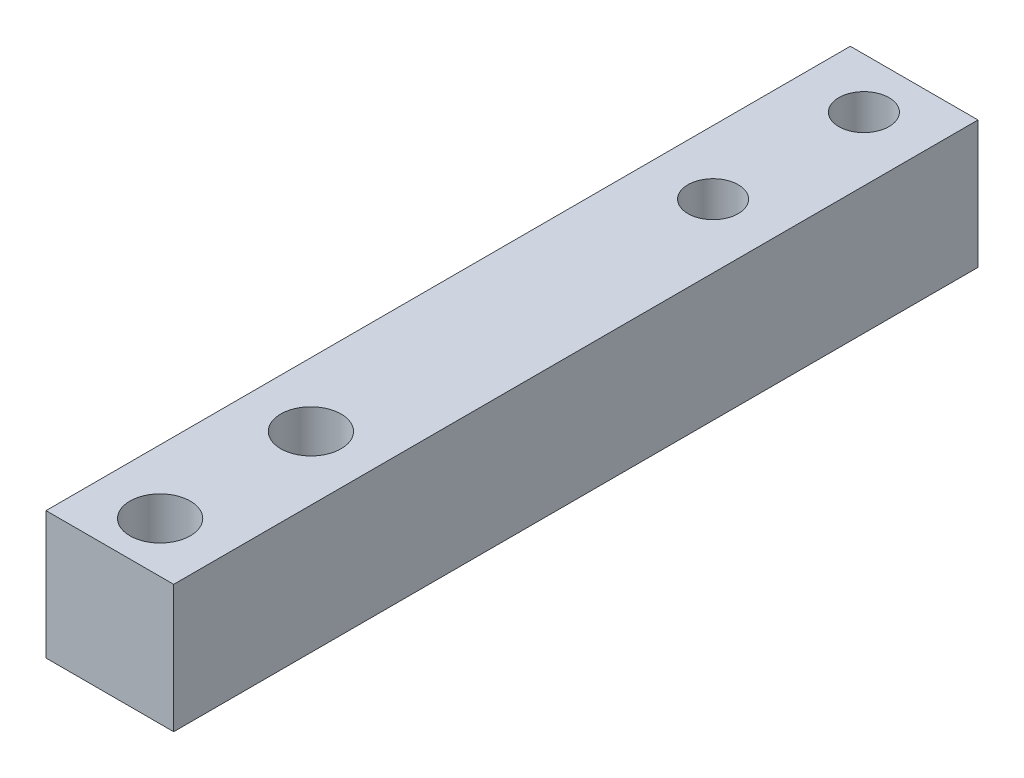
ISO-10303-21;
HEADER;
FILE_DESCRIPTION(('STEP AP214'),'2;1');
FILE_NAME('part.step','',(''),(''),'','','');
FILE_SCHEMA(('AUTOMOTIVE_DESIGN { 1 0 10303 214 1 1 1 1 }'));
ENDSEC;
DATA;
#1=APPLICATION_CONTEXT('core data for automotive mechanical design processes');
#2=APPLICATION_PROTOCOL_DEFINITION('international standard','automotive_design',2000,#1);
#3=PRODUCT_CONTEXT('',#1,'mechanical');
#4=PRODUCT('Part','Part','',(#3));
#5=PRODUCT_RELATED_PRODUCT_CATEGORY('part','',(#4));
#6=PRODUCT_DEFINITION_FORMATION('','',#4);
#7=PRODUCT_DEFINITION_CONTEXT('part definition',#1,'design');
#8=PRODUCT_DEFINITION('design','',#6,#7);
#9=PRODUCT_DEFINITION_SHAPE('','',#8);
#10=(LENGTH_UNIT() NAMED_UNIT(*) SI_UNIT(.MILLI.,.METRE.));
#11=(NAMED_UNIT(*) PLANE_ANGLE_UNIT() SI_UNIT($,.RADIAN.));
#12=(NAMED_UNIT(*) SI_UNIT($,.STERADIAN.) SOLID_ANGLE_UNIT());
#13=UNCERTAINTY_MEASURE_WITH_UNIT(LENGTH_MEASURE(1.E-05),#10,'distance_accuracy_value','');
#14=(GEOMETRIC_REPRESENTATION_CONTEXT(3) GLOBAL_UNCERTAINTY_ASSIGNED_CONTEXT((#13)) GLOBAL_UNIT_ASSIGNED_CONTEXT((#10,
#11,#12)) REPRESENTATION_CONTEXT('',''));
#15=CARTESIAN_POINT('',(0.,0.,0.));
#16=DIRECTION('',(0.,0.,1.));
#17=DIRECTION('',(1.,0.,0.));
#18=AXIS2_PLACEMENT_3D('',#15,#16,#17);
#19=CARTESIAN_POINT('',(-6.35000000000001,12.7,-40.));
#20=DIRECTION('',(1.,0.,0.));
#21=DIRECTION('',(0.,0.,-1.));
#22=AXIS2_PLACEMENT_3D('',#19,#20,#21);
#23=PLANE('',#22);
#24=DIRECTION('',(0.,0.,1.));
#25=VECTOR('',#24,1.);
#26=CARTESIAN_POINT('',(-6.35000000000001,0.,-40.));
#27=LINE('',#26,#25);
#28=CARTESIAN_POINT('',(-6.35000000000001,0.,-40.));
#29=VERTEX_POINT('',#28);
#30=CARTESIAN_POINT('',(-6.34999999999999,0.,40.));
#31=VERTEX_POINT('',#30);
#32=EDGE_CURVE('E102',#29,#31,#27,.T.);
#33=ORIENTED_EDGE('',*,*,#32,.T.);
#34=DIRECTION('',(0.,-1.,0.));
#35=VECTOR('',#34,1.);
#36=CARTESIAN_POINT('',(-6.34999999999999,12.7,40.));
#37=LINE('',#36,#35);
#38=CARTESIAN_POINT('',(-6.34999999999999,12.7,40.));
#39=VERTEX_POINT('',#38);
#40=EDGE_CURVE('E11',#39,#31,#37,.T.);
#41=ORIENTED_EDGE('',*,*,#40,.F.);
#42=DIRECTION('',(0.,0.,1.));
#43=VECTOR('',#42,1.);
#44=CARTESIAN_POINT('',(-6.35000000000001,12.7,-40.));
#45=LINE('',#44,#43);
#46=CARTESIAN_POINT('',(-6.35000000000001,12.7,-40.));
#47=VERTEX_POINT('',#46);
#48=EDGE_CURVE('E90',#47,#39,#45,.T.);
#49=ORIENTED_EDGE('',*,*,#48,.F.);
#50=DIRECTION('',(0.,-1.,0.));
#51=VECTOR('',#50,1.);
#52=CARTESIAN_POINT('',(-6.35000000000001,12.7,-40.));
#53=LINE('',#52,#51);
#54=EDGE_CURVE('E98',#47,#29,#53,.T.);
#55=ORIENTED_EDGE('',*,*,#54,.T.);
#56=EDGE_LOOP('',(#33,#41,#49,#55));
#57=FACE_BOUND('',#56,.T.);
#58=ADVANCED_FACE('F39',(#57),#23,.F.);
#59=CARTESIAN_POINT('',(-6.34999999999999,12.7,40.));
#60=DIRECTION('',(0.,0.,-1.));
#61=DIRECTION('',(-1.,0.,0.));
#62=AXIS2_PLACEMENT_3D('',#59,#60,#61);
#63=PLANE('',#62);
#64=DIRECTION('',(1.,0.,0.));
#65=VECTOR('',#64,1.);
#66=CARTESIAN_POINT('',(-6.34999999999999,0.,40.));
#67=LINE('',#66,#65);
#68=CARTESIAN_POINT('',(6.34999999999995,0.,40.));
#69=VERTEX_POINT('',#68);
#70=EDGE_CURVE('E94',#31,#69,#67,.T.);
#71=ORIENTED_EDGE('',*,*,#70,.T.);
#72=DIRECTION('',(0.,-1.,0.));
#73=VECTOR('',#72,1.);
#74=CARTESIAN_POINT('',(6.34999999999995,12.7,40.));
#75=LINE('',#74,#73);
#76=CARTESIAN_POINT('',(6.34999999999995,12.7,40.));
#77=VERTEX_POINT('',#76);
#78=EDGE_CURVE('E47',#77,#69,#75,.T.);
#79=ORIENTED_EDGE('',*,*,#78,.F.);
#80=DIRECTION('',(1.,0.,0.));
#81=VECTOR('',#80,1.);
#82=CARTESIAN_POINT('',(-6.34999999999999,12.7,40.));
#83=LINE('',#82,#81);
#84=EDGE_CURVE('E85',#39,#77,#83,.T.);
#85=ORIENTED_EDGE('',*,*,#84,.F.);
#86=ORIENTED_EDGE('',*,*,#40,.T.);
#87=EDGE_LOOP('',(#71,#79,#85,#86));
#88=FACE_BOUND('',#87,.T.);
#89=ADVANCED_FACE('F93',(#88),#63,.F.);
#90=CARTESIAN_POINT('',(6.34999999999995,12.7,-40.));
#91=DIRECTION('',(-1.,0.,0.));
#92=DIRECTION('',(0.,0.,1.));
#93=AXIS2_PLACEMENT_3D('',#90,#91,#92);
#94=PLANE('',#93);
#95=DIRECTION('',(0.,0.,-1.));
#96=VECTOR('',#95,1.);
#97=CARTESIAN_POINT('',(6.34999999999995,0.,-40.));
#98=LINE('',#97,#96);
#99=CARTESIAN_POINT('',(6.34999999999995,0.,-40.));
#100=VERTEX_POINT('',#99);
#101=EDGE_CURVE('E72',#69,#100,#98,.T.);
#102=ORIENTED_EDGE('',*,*,#101,.T.);
#103=DIRECTION('',(0.,-1.,0.));
#104=VECTOR('',#103,1.);
#105=CARTESIAN_POINT('',(6.34999999999995,12.7,-40.));
#106=LINE('',#105,#104);
#107=CARTESIAN_POINT('',(6.34999999999995,12.7,-40.));
#108=VERTEX_POINT('',#107);
#109=EDGE_CURVE('E95',#108,#100,#106,.T.);
#110=ORIENTED_EDGE('',*,*,#109,.F.);
#111=DIRECTION('',(0.,0.,-1.));
#112=VECTOR('',#111,1.);
#113=CARTESIAN_POINT('',(6.34999999999995,12.7,-40.));
#114=LINE('',#113,#112);
#115=EDGE_CURVE('E88',#77,#108,#114,.T.);
#116=ORIENTED_EDGE('',*,*,#115,.F.);
#117=ORIENTED_EDGE('',*,*,#78,.T.);
#118=EDGE_LOOP('',(#102,#110,#116,#117));
#119=FACE_BOUND('',#118,.T.);
#120=ADVANCED_FACE('F96',(#119),#94,.F.);
#121=CARTESIAN_POINT('',(-6.35000000000001,12.7,-40.));
#122=DIRECTION('',(0.,0.,1.));
#123=DIRECTION('',(1.,0.,0.));
#124=AXIS2_PLACEMENT_3D('',#121,#122,#123);
#125=PLANE('',#124);
#126=DIRECTION('',(-1.,0.,0.));
#127=VECTOR('',#126,1.);
#128=CARTESIAN_POINT('',(-6.35000000000001,0.,-40.));
#129=LINE('',#128,#127);
#130=EDGE_CURVE('E78',#100,#29,#129,.T.);
#131=ORIENTED_EDGE('',*,*,#130,.T.);
#132=ORIENTED_EDGE('',*,*,#54,.F.);
#133=DIRECTION('',(-1.,0.,0.));
#134=VECTOR('',#133,1.);
#135=CARTESIAN_POINT('',(-6.35000000000001,12.7,-40.));
#136=LINE('',#135,#134);
#137=EDGE_CURVE('E55',#108,#47,#136,.T.);
#138=ORIENTED_EDGE('',*,*,#137,.F.);
#139=ORIENTED_EDGE('',*,*,#109,.T.);
#140=EDGE_LOOP('',(#131,#132,#138,#139));
#141=FACE_BOUND('',#140,.T.);
#142=ADVANCED_FACE('F110',(#141),#125,.F.);
#143=CARTESIAN_POINT('',(0.,12.7,0.));
#144=DIRECTION('',(0.,1.,0.));
#145=DIRECTION('',(0.,0.,1.));
#146=AXIS2_PLACEMENT_3D('',#143,#144,#145);
#147=PLANE('',#146);
#148=CARTESIAN_POINT('',(0.,12.7,-35.));
#149=DIRECTION('',(0.,1.,0.));
#150=DIRECTION('',(0.,0.,1.));
#151=AXIS2_PLACEMENT_3D('',#148,#149,#150);
#152=CIRCLE('',#151,2.5);
#153=CARTESIAN_POINT('',(0.,12.7,-32.5));
#154=VERTEX_POINT('',#153);
#155=EDGE_CURVE('E132',#154,#154,#152,.T.);
#156=ORIENTED_EDGE('',*,*,#155,.F.);
#157=EDGE_LOOP('',(#156));
#158=FACE_BOUND('',#157,.T.);
#159=CARTESIAN_POINT('',(0.,12.7,-20.));
#160=DIRECTION('',(0.,1.,0.));
#161=DIRECTION('',(0.,0.,1.));
#162=AXIS2_PLACEMENT_3D('',#159,#160,#161);
#163=CIRCLE('',#162,2.5);
#164=CARTESIAN_POINT('',(0.,12.7,-17.5));
#165=VERTEX_POINT('',#164);
#166=EDGE_CURVE('E129',#165,#165,#163,.T.);
#167=ORIENTED_EDGE('',*,*,#166,.F.);
#168=EDGE_LOOP('',(#167));
#169=FACE_BOUND('',#168,.T.);
#170=CARTESIAN_POINT('',(0.,12.7,20.));
#171=DIRECTION('',(0.,1.,0.));
#172=DIRECTION('',(0.,0.,1.));
#173=AXIS2_PLACEMENT_3D('',#170,#171,#172);
#174=CIRCLE('',#173,3.);
#175=CARTESIAN_POINT('',(0.,12.7,23.));
#176=VERTEX_POINT('',#175);
#177=EDGE_CURVE('E123',#176,#176,#174,.T.);
#178=ORIENTED_EDGE('',*,*,#177,.F.);
#179=EDGE_LOOP('',(#178));
#180=FACE_BOUND('',#179,.T.);
#181=CARTESIAN_POINT('',(0.,12.7,35.));
#182=DIRECTION('',(0.,1.,0.));
#183=DIRECTION('',(0.,0.,1.));
#184=AXIS2_PLACEMENT_3D('',#181,#182,#183);
#185=CIRCLE('',#184,3.);
#186=CARTESIAN_POINT('',(0.,12.7,38.));
#187=VERTEX_POINT('',#186);
#188=EDGE_CURVE('E116',#187,#187,#185,.T.);
#189=ORIENTED_EDGE('',*,*,#188,.F.);
#190=EDGE_LOOP('',(#189));
#191=FACE_BOUND('',#190,.T.);
#192=ORIENTED_EDGE('',*,*,#48,.T.);
#193=ORIENTED_EDGE('',*,*,#84,.T.);
#194=ORIENTED_EDGE('',*,*,#115,.T.);
#195=ORIENTED_EDGE('',*,*,#137,.T.);
#196=EDGE_LOOP('',(#192,#193,#194,#195));
#197=FACE_BOUND('',#196,.T.);
#198=ADVANCED_FACE('F86',(#158,#169,#180,#191,#197),#147,.T.);
#199=CARTESIAN_POINT('',(0.,0.,0.));
#200=DIRECTION('',(0.,1.,0.));
#201=DIRECTION('',(0.,0.,1.));
#202=AXIS2_PLACEMENT_3D('',#199,#200,#201);
#203=PLANE('',#202);
#204=CARTESIAN_POINT('',(0.,0.,-35.));
#205=DIRECTION('',(0.,1.,0.));
#206=DIRECTION('',(0.,0.,1.));
#207=AXIS2_PLACEMENT_3D('',#204,#205,#206);
#208=CIRCLE('',#207,2.5);
#209=CARTESIAN_POINT('',(0.,0.,-32.5));
#210=VERTEX_POINT('',#209);
#211=EDGE_CURVE('E105',#210,#210,#208,.F.);
#212=ORIENTED_EDGE('',*,*,#211,.F.);
#213=EDGE_LOOP('',(#212));
#214=FACE_BOUND('',#213,.T.);
#215=CARTESIAN_POINT('',(0.,0.,-20.));
#216=DIRECTION('',(0.,1.,0.));
#217=DIRECTION('',(0.,0.,1.));
#218=AXIS2_PLACEMENT_3D('',#215,#216,#217);
#219=CIRCLE('',#218,2.5);
#220=CARTESIAN_POINT('',(0.,0.,-17.5));
#221=VERTEX_POINT('',#220);
#222=EDGE_CURVE('E126',#221,#221,#219,.F.);
#223=ORIENTED_EDGE('',*,*,#222,.F.);
#224=EDGE_LOOP('',(#223));
#225=FACE_BOUND('',#224,.T.);
#226=CARTESIAN_POINT('',(0.,0.,20.));
#227=DIRECTION('',(0.,1.,0.));
#228=DIRECTION('',(0.,0.,1.));
#229=AXIS2_PLACEMENT_3D('',#226,#227,#228);
#230=CIRCLE('',#229,3.);
#231=CARTESIAN_POINT('',(0.,0.,23.));
#232=VERTEX_POINT('',#231);
#233=EDGE_CURVE('E119',#232,#232,#230,.F.);
#234=ORIENTED_EDGE('',*,*,#233,.F.);
#235=EDGE_LOOP('',(#234));
#236=FACE_BOUND('',#235,.T.);
#237=CARTESIAN_POINT('',(0.,0.,35.));
#238=DIRECTION('',(0.,1.,0.));
#239=DIRECTION('',(0.,0.,1.));
#240=AXIS2_PLACEMENT_3D('',#237,#238,#239);
#241=CIRCLE('',#240,3.);
#242=CARTESIAN_POINT('',(0.,0.,38.));
#243=VERTEX_POINT('',#242);
#244=EDGE_CURVE('E120',#243,#243,#241,.F.);
#245=ORIENTED_EDGE('',*,*,#244,.F.);
#246=EDGE_LOOP('',(#245));
#247=FACE_BOUND('',#246,.T.);
#248=ORIENTED_EDGE('',*,*,#32,.F.);
#249=ORIENTED_EDGE('',*,*,#130,.F.);
#250=ORIENTED_EDGE('',*,*,#101,.F.);
#251=ORIENTED_EDGE('',*,*,#70,.F.);
#252=EDGE_LOOP('',(#248,#249,#250,#251));
#253=FACE_BOUND('',#252,.T.);
#254=ADVANCED_FACE('F113',(#214,#225,#236,#247,#253),#203,.F.);
#255=CARTESIAN_POINT('',(0.,-8.48528137423857,35.));
#256=DIRECTION('',(0.,1.,0.));
#257=DIRECTION('',(0.,0.,1.));
#258=AXIS2_PLACEMENT_3D('',#255,#256,#257);
#259=CYLINDRICAL_SURFACE('',#258,3.);
#260=CARTESIAN_POINT('',(0.,0.,38.));
#261=CARTESIAN_POINT('',(0.,0.132291666666665,38.));
#262=CARTESIAN_POINT('',(0.,0.264583333333331,38.));
#263=CARTESIAN_POINT('',(0.,0.529166666666664,38.));
#264=CARTESIAN_POINT('',(0.,0.661458333333331,38.));
#265=CARTESIAN_POINT('',(0.,0.926041666666665,38.));
#266=CARTESIAN_POINT('',(0.,1.05833333333333,38.));
#267=CARTESIAN_POINT('',(0.,1.32291666666667,38.));
#268=CARTESIAN_POINT('',(0.,1.45520833333333,38.));
#269=CARTESIAN_POINT('',(0.,1.71979166666667,38.));
#270=CARTESIAN_POINT('',(0.,1.85208333333333,38.));
#271=CARTESIAN_POINT('',(0.,2.11666666666667,38.));
#272=CARTESIAN_POINT('',(0.,2.24895833333333,38.));
#273=CARTESIAN_POINT('',(0.,2.51354166666667,38.));
#274=CARTESIAN_POINT('',(0.,2.64583333333333,38.));
#275=CARTESIAN_POINT('',(0.,2.91041666666667,38.));
#276=CARTESIAN_POINT('',(0.,3.04270833333333,38.));
#277=CARTESIAN_POINT('',(0.,3.30729166666667,38.));
#278=CARTESIAN_POINT('',(0.,3.43958333333333,38.));
#279=CARTESIAN_POINT('',(0.,3.70416666666667,38.));
#280=CARTESIAN_POINT('',(0.,3.83645833333333,38.));
#281=CARTESIAN_POINT('',(0.,4.10104166666667,38.));
#282=CARTESIAN_POINT('',(0.,4.23333333333333,38.));
#283=CARTESIAN_POINT('',(0.,4.49791666666667,38.));
#284=CARTESIAN_POINT('',(0.,4.63020833333333,38.));
#285=CARTESIAN_POINT('',(0.,4.89479166666667,38.));
#286=CARTESIAN_POINT('',(0.,5.02708333333333,38.));
#287=CARTESIAN_POINT('',(0.,5.29166666666667,38.));
#288=CARTESIAN_POINT('',(0.,5.42395833333333,38.));
#289=CARTESIAN_POINT('',(0.,5.68854166666667,38.));
#290=CARTESIAN_POINT('',(0.,5.82083333333333,38.));
#291=CARTESIAN_POINT('',(0.,6.08541666666667,38.));
#292=CARTESIAN_POINT('',(0.,6.21770833333333,38.));
#293=CARTESIAN_POINT('',(0.,6.48229166666667,38.));
#294=CARTESIAN_POINT('',(0.,6.61458333333333,38.));
#295=CARTESIAN_POINT('',(0.,6.87916666666667,38.));
#296=CARTESIAN_POINT('',(0.,7.01145833333333,38.));
#297=CARTESIAN_POINT('',(0.,7.27604166666666,38.));
#298=CARTESIAN_POINT('',(0.,7.40833333333333,38.));
#299=CARTESIAN_POINT('',(0.,7.67291666666666,38.));
#300=CARTESIAN_POINT('',(0.,7.80520833333333,38.));
#301=CARTESIAN_POINT('',(0.,8.06979166666666,38.));
#302=CARTESIAN_POINT('',(0.,8.20208333333333,38.));
#303=CARTESIAN_POINT('',(0.,8.46666666666667,38.));
#304=CARTESIAN_POINT('',(0.,8.59895833333333,38.));
#305=CARTESIAN_POINT('',(0.,8.86354166666666,38.));
#306=CARTESIAN_POINT('',(0.,8.99583333333333,38.));
#307=CARTESIAN_POINT('',(0.,9.26041666666666,38.));
#308=CARTESIAN_POINT('',(0.,9.39270833333333,38.));
#309=CARTESIAN_POINT('',(0.,9.65729166666667,38.));
#310=CARTESIAN_POINT('',(0.,9.78958333333333,38.));
#311=CARTESIAN_POINT('',(0.,10.0541666666667,38.));
#312=CARTESIAN_POINT('',(0.,10.1864583333333,38.));
#313=CARTESIAN_POINT('',(0.,10.4510416666667,38.));
#314=CARTESIAN_POINT('',(0.,10.5833333333333,38.));
#315=CARTESIAN_POINT('',(0.,10.8479166666667,38.));
#316=CARTESIAN_POINT('',(0.,10.9802083333333,38.));
#317=CARTESIAN_POINT('',(0.,11.2447916666667,38.));
#318=CARTESIAN_POINT('',(0.,11.3770833333333,38.));
#319=CARTESIAN_POINT('',(0.,11.6416666666667,38.));
#320=CARTESIAN_POINT('',(0.,11.7739583333333,38.));
#321=CARTESIAN_POINT('',(0.,12.0385416666667,38.));
#322=CARTESIAN_POINT('',(0.,12.1708333333333,38.));
#323=CARTESIAN_POINT('',(0.,12.4354166666667,38.));
#324=CARTESIAN_POINT('',(0.,12.5677083333333,38.));
#325=CARTESIAN_POINT('',(0.,12.7,38.));
#326=B_SPLINE_CURVE_WITH_KNOTS('',3,(#260,#261,#262,#263,#264,#265,#266,#267,#268,#269,#270,
#271,#272,#273,#274,#275,#276,#277,#278,#279,#280,#281,#282,#283,#284,#285,#286,#287,#288,#289,
#290,#291,#292,#293,#294,#295,#296,#297,#298,#299,#300,#301,#302,#303,#304,#305,#306,#307,#308,
#309,#310,#311,#312,#313,#314,#315,#316,#317,#318,#319,#320,#321,#322,#323,#324,#325),
.UNSPECIFIED.,.F.,.F.,(4,2,2,2,2,2,2,2,2,2,2,2,2,2,2,2,2,2,2,2,2,2,2,2,2,2,2,2,2,2,2,2,4),(0.,
0.396875,0.793749999999999,1.190625,1.5875,1.984375,2.38125,2.778125,3.175,3.571875,3.96875,
4.365625,4.7625,5.159375,5.55625,5.953125,6.35,6.746875,7.14375,7.540625,7.9375,8.334375,
8.73125,9.128125,9.525,9.921875,10.31875,10.715625,11.1125,11.509375,11.90625,12.303125,12.7),.UNSPECIFIED.);
#327=EDGE_CURVE('BSEAM151',#243,#187,#326,.T.);
#328=ORIENTED_EDGE('',*,*,#244,.T.);
#329=ORIENTED_EDGE('',*,*,#188,.T.);
#330=ORIENTED_EDGE('',*,*,#327,.T.);
#331=ORIENTED_EDGE('',*,*,#327,.F.);
#332=EDGE_LOOP('',(#328,#330,#329,#331));
#333=FACE_BOUND('',#332,.T.);
#334=ADVANCED_FACE('F151',(#333),#259,.F.);
#335=CARTESIAN_POINT('',(0.,-8.48528137423857,20.));
#336=DIRECTION('',(0.,1.,0.));
#337=DIRECTION('',(0.,0.,1.));
#338=AXIS2_PLACEMENT_3D('',#335,#336,#337);
#339=CYLINDRICAL_SURFACE('',#338,3.);
#340=CARTESIAN_POINT('',(0.,0.,23.));
#341=CARTESIAN_POINT('',(0.,0.132291666666665,23.));
#342=CARTESIAN_POINT('',(0.,0.264583333333331,23.));
#343=CARTESIAN_POINT('',(0.,0.529166666666664,23.));
#344=CARTESIAN_POINT('',(0.,0.661458333333331,23.));
#345=CARTESIAN_POINT('',(0.,0.926041666666665,23.));
#346=CARTESIAN_POINT('',(0.,1.05833333333333,23.));
#347=CARTESIAN_POINT('',(0.,1.32291666666667,23.));
#348=CARTESIAN_POINT('',(0.,1.45520833333333,23.));
#349=CARTESIAN_POINT('',(0.,1.71979166666667,23.));
#350=CARTESIAN_POINT('',(0.,1.85208333333333,23.));
#351=CARTESIAN_POINT('',(0.,2.11666666666667,23.));
#352=CARTESIAN_POINT('',(0.,2.24895833333333,23.));
#353=CARTESIAN_POINT('',(0.,2.51354166666667,23.));
#354=CARTESIAN_POINT('',(0.,2.64583333333333,23.));
#355=CARTESIAN_POINT('',(0.,2.91041666666667,23.));
#356=CARTESIAN_POINT('',(0.,3.04270833333333,23.));
#357=CARTESIAN_POINT('',(0.,3.30729166666667,23.));
#358=CARTESIAN_POINT('',(0.,3.43958333333333,23.));
#359=CARTESIAN_POINT('',(0.,3.70416666666667,23.));
#360=CARTESIAN_POINT('',(0.,3.83645833333333,23.));
#361=CARTESIAN_POINT('',(0.,4.10104166666667,23.));
#362=CARTESIAN_POINT('',(0.,4.23333333333333,23.));
#363=CARTESIAN_POINT('',(0.,4.49791666666667,23.));
#364=CARTESIAN_POINT('',(0.,4.63020833333333,23.));
#365=CARTESIAN_POINT('',(0.,4.89479166666667,23.));
#366=CARTESIAN_POINT('',(0.,5.02708333333333,23.));
#367=CARTESIAN_POINT('',(0.,5.29166666666667,23.));
#368=CARTESIAN_POINT('',(0.,5.42395833333333,23.));
#369=CARTESIAN_POINT('',(0.,5.68854166666667,23.));
#370=CARTESIAN_POINT('',(0.,5.82083333333333,23.));
#371=CARTESIAN_POINT('',(0.,6.08541666666667,23.));
#372=CARTESIAN_POINT('',(0.,6.21770833333333,23.));
#373=CARTESIAN_POINT('',(0.,6.48229166666667,23.));
#374=CARTESIAN_POINT('',(0.,6.61458333333333,23.));
#375=CARTESIAN_POINT('',(0.,6.87916666666667,23.));
#376=CARTESIAN_POINT('',(0.,7.01145833333333,23.));
#377=CARTESIAN_POINT('',(0.,7.27604166666666,23.));
#378=CARTESIAN_POINT('',(0.,7.40833333333333,23.));
#379=CARTESIAN_POINT('',(0.,7.67291666666666,23.));
#380=CARTESIAN_POINT('',(0.,7.80520833333333,23.));
#381=CARTESIAN_POINT('',(0.,8.06979166666666,23.));
#382=CARTESIAN_POINT('',(0.,8.20208333333333,23.));
#383=CARTESIAN_POINT('',(0.,8.46666666666667,23.));
#384=CARTESIAN_POINT('',(0.,8.59895833333333,23.));
#385=CARTESIAN_POINT('',(0.,8.86354166666666,23.));
#386=CARTESIAN_POINT('',(0.,8.99583333333333,23.));
#387=CARTESIAN_POINT('',(0.,9.26041666666666,23.));
#388=CARTESIAN_POINT('',(0.,9.39270833333333,23.));
#389=CARTESIAN_POINT('',(0.,9.65729166666667,23.));
#390=CARTESIAN_POINT('',(0.,9.78958333333333,23.));
#391=CARTESIAN_POINT('',(0.,10.0541666666667,23.));
#392=CARTESIAN_POINT('',(0.,10.1864583333333,23.));
#393=CARTESIAN_POINT('',(0.,10.4510416666667,23.));
#394=CARTESIAN_POINT('',(0.,10.5833333333333,23.));
#395=CARTESIAN_POINT('',(0.,10.8479166666667,23.));
#396=CARTESIAN_POINT('',(0.,10.9802083333333,23.));
#397=CARTESIAN_POINT('',(0.,11.2447916666667,23.));
#398=CARTESIAN_POINT('',(0.,11.3770833333333,23.));
#399=CARTESIAN_POINT('',(0.,11.6416666666667,23.));
#400=CARTESIAN_POINT('',(0.,11.7739583333333,23.));
#401=CARTESIAN_POINT('',(0.,12.0385416666667,23.));
#402=CARTESIAN_POINT('',(0.,12.1708333333333,23.));
#403=CARTESIAN_POINT('',(0.,12.4354166666667,23.));
#404=CARTESIAN_POINT('',(0.,12.5677083333333,23.));
#405=CARTESIAN_POINT('',(0.,12.7,23.));
#406=B_SPLINE_CURVE_WITH_KNOTS('',3,(#340,#341,#342,#343,#344,#345,#346,#347,#348,#349,#350,
#351,#352,#353,#354,#355,#356,#357,#358,#359,#360,#361,#362,#363,#364,#365,#366,#367,#368,#369,
#370,#371,#372,#373,#374,#375,#376,#377,#378,#379,#380,#381,#382,#383,#384,#385,#386,#387,#388,
#389,#390,#391,#392,#393,#394,#395,#396,#397,#398,#399,#400,#401,#402,#403,#404,#405),
.UNSPECIFIED.,.F.,.F.,(4,2,2,2,2,2,2,2,2,2,2,2,2,2,2,2,2,2,2,2,2,2,2,2,2,2,2,2,2,2,2,2,4),(0.,
0.396875,0.793749999999999,1.190625,1.5875,1.984375,2.38125,2.778125,3.175,3.571875,3.96875,
4.365625,4.7625,5.159375,5.55625,5.953125,6.35,6.746875,7.14375,7.540625,7.9375,8.334375,
8.73125,9.128125,9.525,9.921875,10.31875,10.715625,11.1125,11.509375,11.90625,12.303125,12.7),.UNSPECIFIED.);
#407=EDGE_CURVE('BSEAM153',#232,#176,#406,.T.);
#408=ORIENTED_EDGE('',*,*,#233,.T.);
#409=ORIENTED_EDGE('',*,*,#177,.T.);
#410=ORIENTED_EDGE('',*,*,#407,.T.);
#411=ORIENTED_EDGE('',*,*,#407,.F.);
#412=EDGE_LOOP('',(#408,#410,#409,#411));
#413=FACE_BOUND('',#412,.T.);
#414=ADVANCED_FACE('F153',(#413),#339,.F.);
#415=CARTESIAN_POINT('',(0.,-8.48528137423857,-20.));
#416=DIRECTION('',(0.,1.,0.));
#417=DIRECTION('',(0.,0.,1.));
#418=AXIS2_PLACEMENT_3D('',#415,#416,#417);
#419=CYLINDRICAL_SURFACE('',#418,2.5);
#420=CARTESIAN_POINT('',(0.,0.,-17.5));
#421=CARTESIAN_POINT('',(0.,0.132291666666665,-17.5));
#422=CARTESIAN_POINT('',(0.,0.264583333333331,-17.5));
#423=CARTESIAN_POINT('',(0.,0.529166666666664,-17.5));
#424=CARTESIAN_POINT('',(0.,0.661458333333331,-17.5));
#425=CARTESIAN_POINT('',(0.,0.926041666666665,-17.5));
#426=CARTESIAN_POINT('',(0.,1.05833333333333,-17.5));
#427=CARTESIAN_POINT('',(0.,1.32291666666667,-17.5));
#428=CARTESIAN_POINT('',(0.,1.45520833333333,-17.5));
#429=CARTESIAN_POINT('',(0.,1.71979166666667,-17.5));
#430=CARTESIAN_POINT('',(0.,1.85208333333333,-17.5));
#431=CARTESIAN_POINT('',(0.,2.11666666666667,-17.5));
#432=CARTESIAN_POINT('',(0.,2.24895833333333,-17.5));
#433=CARTESIAN_POINT('',(0.,2.51354166666667,-17.5));
#434=CARTESIAN_POINT('',(0.,2.64583333333333,-17.5));
#435=CARTESIAN_POINT('',(0.,2.91041666666667,-17.5));
#436=CARTESIAN_POINT('',(0.,3.04270833333333,-17.5));
#437=CARTESIAN_POINT('',(0.,3.30729166666667,-17.5));
#438=CARTESIAN_POINT('',(0.,3.43958333333333,-17.5));
#439=CARTESIAN_POINT('',(0.,3.70416666666667,-17.5));
#440=CARTESIAN_POINT('',(0.,3.83645833333333,-17.5));
#441=CARTESIAN_POINT('',(0.,4.10104166666667,-17.5));
#442=CARTESIAN_POINT('',(0.,4.23333333333333,-17.5));
#443=CARTESIAN_POINT('',(0.,4.49791666666667,-17.5));
#444=CARTESIAN_POINT('',(0.,4.63020833333333,-17.5));
#445=CARTESIAN_POINT('',(0.,4.89479166666667,-17.5));
#446=CARTESIAN_POINT('',(0.,5.02708333333333,-17.5));
#447=CARTESIAN_POINT('',(0.,5.29166666666667,-17.5));
#448=CARTESIAN_POINT('',(0.,5.42395833333333,-17.5));
#449=CARTESIAN_POINT('',(0.,5.68854166666667,-17.5));
#450=CARTESIAN_POINT('',(0.,5.82083333333333,-17.5));
#451=CARTESIAN_POINT('',(0.,6.08541666666667,-17.5));
#452=CARTESIAN_POINT('',(0.,6.21770833333333,-17.5));
#453=CARTESIAN_POINT('',(0.,6.48229166666667,-17.5));
#454=CARTESIAN_POINT('',(0.,6.61458333333333,-17.5));
#455=CARTESIAN_POINT('',(0.,6.87916666666667,-17.5));
#456=CARTESIAN_POINT('',(0.,7.01145833333333,-17.5));
#457=CARTESIAN_POINT('',(0.,7.27604166666666,-17.5));
#458=CARTESIAN_POINT('',(0.,7.40833333333333,-17.5));
#459=CARTESIAN_POINT('',(0.,7.67291666666666,-17.5));
#460=CARTESIAN_POINT('',(0.,7.80520833333333,-17.5));
#461=CARTESIAN_POINT('',(0.,8.06979166666666,-17.5));
#462=CARTESIAN_POINT('',(0.,8.20208333333333,-17.5));
#463=CARTESIAN_POINT('',(0.,8.46666666666667,-17.5));
#464=CARTESIAN_POINT('',(0.,8.59895833333333,-17.5));
#465=CARTESIAN_POINT('',(0.,8.86354166666666,-17.5));
#466=CARTESIAN_POINT('',(0.,8.99583333333333,-17.5));
#467=CARTESIAN_POINT('',(0.,9.26041666666666,-17.5));
#468=CARTESIAN_POINT('',(0.,9.39270833333333,-17.5));
#469=CARTESIAN_POINT('',(0.,9.65729166666667,-17.5));
#470=CARTESIAN_POINT('',(0.,9.78958333333333,-17.5));
#471=CARTESIAN_POINT('',(0.,10.0541666666667,-17.5));
#472=CARTESIAN_POINT('',(0.,10.1864583333333,-17.5));
#473=CARTESIAN_POINT('',(0.,10.4510416666667,-17.5));
#474=CARTESIAN_POINT('',(0.,10.5833333333333,-17.5));
#475=CARTESIAN_POINT('',(0.,10.8479166666667,-17.5));
#476=CARTESIAN_POINT('',(0.,10.9802083333333,-17.5));
#477=CARTESIAN_POINT('',(0.,11.2447916666667,-17.5));
#478=CARTESIAN_POINT('',(0.,11.3770833333333,-17.5));
#479=CARTESIAN_POINT('',(0.,11.6416666666667,-17.5));
#480=CARTESIAN_POINT('',(0.,11.7739583333333,-17.5));
#481=CARTESIAN_POINT('',(0.,12.0385416666667,-17.5));
#482=CARTESIAN_POINT('',(0.,12.1708333333333,-17.5));
#483=CARTESIAN_POINT('',(0.,12.4354166666667,-17.5));
#484=CARTESIAN_POINT('',(0.,12.5677083333333,-17.5));
#485=CARTESIAN_POINT('',(0.,12.7,-17.5));
#486=B_SPLINE_CURVE_WITH_KNOTS('',3,(#420,#421,#422,#423,#424,#425,#426,#427,#428,#429,#430,
#431,#432,#433,#434,#435,#436,#437,#438,#439,#440,#441,#442,#443,#444,#445,#446,#447,#448,#449,
#450,#451,#452,#453,#454,#455,#456,#457,#458,#459,#460,#461,#462,#463,#464,#465,#466,#467,#468,
#469,#470,#471,#472,#473,#474,#475,#476,#477,#478,#479,#480,#481,#482,#483,#484,#485),
.UNSPECIFIED.,.F.,.F.,(4,2,2,2,2,2,2,2,2,2,2,2,2,2,2,2,2,2,2,2,2,2,2,2,2,2,2,2,2,2,2,2,4),(0.,
0.396875,0.793749999999999,1.190625,1.5875,1.984375,2.38125,2.778125,3.175,3.571875,3.96875,
4.365625,4.7625,5.159375,5.55625,5.953125,6.35,6.746875,7.14375,7.540625,7.9375,8.334375,
8.73125,9.128125,9.525,9.921875,10.31875,10.715625,11.1125,11.509375,11.90625,12.303125,12.7),.UNSPECIFIED.);
#487=EDGE_CURVE('BSEAM160',#221,#165,#486,.T.);
#488=ORIENTED_EDGE('',*,*,#222,.T.);
#489=ORIENTED_EDGE('',*,*,#166,.T.);
#490=ORIENTED_EDGE('',*,*,#487,.T.);
#491=ORIENTED_EDGE('',*,*,#487,.F.);
#492=EDGE_LOOP('',(#488,#490,#489,#491));
#493=FACE_BOUND('',#492,.T.);
#494=ADVANCED_FACE('F160',(#493),#419,.F.);
#495=CARTESIAN_POINT('',(0.,-8.48528137423857,-35.));
#496=DIRECTION('',(0.,1.,0.));
#497=DIRECTION('',(0.,0.,1.));
#498=AXIS2_PLACEMENT_3D('',#495,#496,#497);
#499=CYLINDRICAL_SURFACE('',#498,2.5);
#500=CARTESIAN_POINT('',(0.,0.,-32.5));
#501=CARTESIAN_POINT('',(0.,0.132291666666665,-32.5));
#502=CARTESIAN_POINT('',(0.,0.264583333333331,-32.5));
#503=CARTESIAN_POINT('',(0.,0.529166666666664,-32.5));
#504=CARTESIAN_POINT('',(0.,0.661458333333331,-32.5));
#505=CARTESIAN_POINT('',(0.,0.926041666666665,-32.5));
#506=CARTESIAN_POINT('',(0.,1.05833333333333,-32.5));
#507=CARTESIAN_POINT('',(0.,1.32291666666667,-32.5));
#508=CARTESIAN_POINT('',(0.,1.45520833333333,-32.5));
#509=CARTESIAN_POINT('',(0.,1.71979166666667,-32.5));
#510=CARTESIAN_POINT('',(0.,1.85208333333333,-32.5));
#511=CARTESIAN_POINT('',(0.,2.11666666666667,-32.5));
#512=CARTESIAN_POINT('',(0.,2.24895833333333,-32.5));
#513=CARTESIAN_POINT('',(0.,2.51354166666667,-32.5));
#514=CARTESIAN_POINT('',(0.,2.64583333333333,-32.5));
#515=CARTESIAN_POINT('',(0.,2.91041666666667,-32.5));
#516=CARTESIAN_POINT('',(0.,3.04270833333333,-32.5));
#517=CARTESIAN_POINT('',(0.,3.30729166666667,-32.5));
#518=CARTESIAN_POINT('',(0.,3.43958333333333,-32.5));
#519=CARTESIAN_POINT('',(0.,3.70416666666667,-32.5));
#520=CARTESIAN_POINT('',(0.,3.83645833333333,-32.5));
#521=CARTESIAN_POINT('',(0.,4.10104166666667,-32.5));
#522=CARTESIAN_POINT('',(0.,4.23333333333333,-32.5));
#523=CARTESIAN_POINT('',(0.,4.49791666666667,-32.5));
#524=CARTESIAN_POINT('',(0.,4.63020833333333,-32.5));
#525=CARTESIAN_POINT('',(0.,4.89479166666667,-32.5));
#526=CARTESIAN_POINT('',(0.,5.02708333333333,-32.5));
#527=CARTESIAN_POINT('',(0.,5.29166666666667,-32.5));
#528=CARTESIAN_POINT('',(0.,5.42395833333333,-32.5));
#529=CARTESIAN_POINT('',(0.,5.68854166666667,-32.5));
#530=CARTESIAN_POINT('',(0.,5.82083333333333,-32.5));
#531=CARTESIAN_POINT('',(0.,6.08541666666667,-32.5));
#532=CARTESIAN_POINT('',(0.,6.21770833333333,-32.5));
#533=CARTESIAN_POINT('',(0.,6.48229166666667,-32.5));
#534=CARTESIAN_POINT('',(0.,6.61458333333333,-32.5));
#535=CARTESIAN_POINT('',(0.,6.87916666666667,-32.5));
#536=CARTESIAN_POINT('',(0.,7.01145833333333,-32.5));
#537=CARTESIAN_POINT('',(0.,7.27604166666666,-32.5));
#538=CARTESIAN_POINT('',(0.,7.40833333333333,-32.5));
#539=CARTESIAN_POINT('',(0.,7.67291666666666,-32.5));
#540=CARTESIAN_POINT('',(0.,7.80520833333333,-32.5));
#541=CARTESIAN_POINT('',(0.,8.06979166666666,-32.5));
#542=CARTESIAN_POINT('',(0.,8.20208333333333,-32.5));
#543=CARTESIAN_POINT('',(0.,8.46666666666667,-32.5));
#544=CARTESIAN_POINT('',(0.,8.59895833333333,-32.5));
#545=CARTESIAN_POINT('',(0.,8.86354166666666,-32.5));
#546=CARTESIAN_POINT('',(0.,8.99583333333333,-32.5));
#547=CARTESIAN_POINT('',(0.,9.26041666666666,-32.5));
#548=CARTESIAN_POINT('',(0.,9.39270833333333,-32.5));
#549=CARTESIAN_POINT('',(0.,9.65729166666667,-32.5));
#550=CARTESIAN_POINT('',(0.,9.78958333333333,-32.5));
#551=CARTESIAN_POINT('',(0.,10.0541666666667,-32.5));
#552=CARTESIAN_POINT('',(0.,10.1864583333333,-32.5));
#553=CARTESIAN_POINT('',(0.,10.4510416666667,-32.5));
#554=CARTESIAN_POINT('',(0.,10.5833333333333,-32.5));
#555=CARTESIAN_POINT('',(0.,10.8479166666667,-32.5));
#556=CARTESIAN_POINT('',(0.,10.9802083333333,-32.5));
#557=CARTESIAN_POINT('',(0.,11.2447916666667,-32.5));
#558=CARTESIAN_POINT('',(0.,11.3770833333333,-32.5));
#559=CARTESIAN_POINT('',(0.,11.6416666666667,-32.5));
#560=CARTESIAN_POINT('',(0.,11.7739583333333,-32.5));
#561=CARTESIAN_POINT('',(0.,12.0385416666667,-32.5));
#562=CARTESIAN_POINT('',(0.,12.1708333333333,-32.5));
#563=CARTESIAN_POINT('',(0.,12.4354166666667,-32.5));
#564=CARTESIAN_POINT('',(0.,12.5677083333333,-32.5));
#565=CARTESIAN_POINT('',(0.,12.7,-32.5));
#566=B_SPLINE_CURVE_WITH_KNOTS('',3,(#500,#501,#502,#503,#504,#505,#506,#507,#508,#509,#510,
#511,#512,#513,#514,#515,#516,#517,#518,#519,#520,#521,#522,#523,#524,#525,#526,#527,#528,#529,
#530,#531,#532,#533,#534,#535,#536,#537,#538,#539,#540,#541,#542,#543,#544,#545,#546,#547,#548,
#549,#550,#551,#552,#553,#554,#555,#556,#557,#558,#559,#560,#561,#562,#563,#564,#565),
.UNSPECIFIED.,.F.,.F.,(4,2,2,2,2,2,2,2,2,2,2,2,2,2,2,2,2,2,2,2,2,2,2,2,2,2,2,2,2,2,2,2,4),(0.,
0.396875,0.793749999999999,1.190625,1.5875,1.984375,2.38125,2.778125,3.175,3.571875,3.96875,
4.365625,4.7625,5.159375,5.55625,5.953125,6.35,6.746875,7.14375,7.540625,7.9375,8.334375,
8.73125,9.128125,9.525,9.921875,10.31875,10.715625,11.1125,11.509375,11.90625,12.303125,12.7),.UNSPECIFIED.);
#567=EDGE_CURVE('BSEAM140',#210,#154,#566,.T.);
#568=ORIENTED_EDGE('',*,*,#211,.T.);
#569=ORIENTED_EDGE('',*,*,#155,.T.);
#570=ORIENTED_EDGE('',*,*,#567,.T.);
#571=ORIENTED_EDGE('',*,*,#567,.F.);
#572=EDGE_LOOP('',(#568,#570,#569,#571));
#573=FACE_BOUND('',#572,.T.);
#574=ADVANCED_FACE('F140',(#573),#499,.F.);
#575=CLOSED_SHELL('',(#58,#89,#120,#142,#198,#254,#334,#414,#494,#574));
#576=MANIFOLD_SOLID_BREP('B2',#575);
#577=ADVANCED_BREP_SHAPE_REPRESENTATION('',(#18,#576),#14);
#578=SHAPE_DEFINITION_REPRESENTATION(#9,#577);
ENDSEC;
END-ISO-10303-21;
